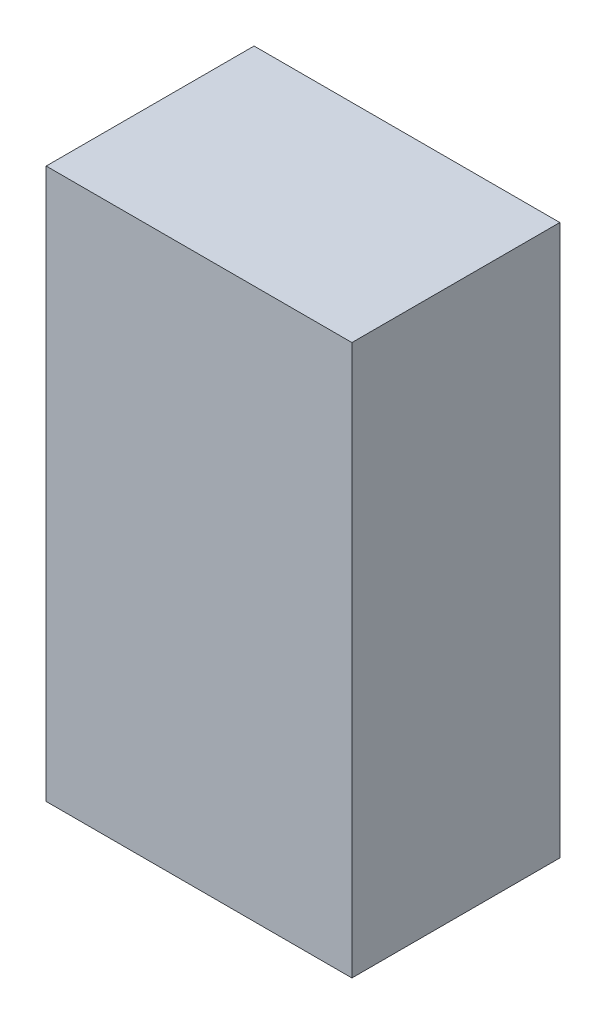
ISO-10303-21;
HEADER;
FILE_DESCRIPTION(('STEP AP214'),'2;1');
FILE_NAME('part.step','',(''),(''),'','','');
FILE_SCHEMA(('AUTOMOTIVE_DESIGN { 1 0 10303 214 1 1 1 1 }'));
ENDSEC;
DATA;
#1=APPLICATION_CONTEXT('core data for automotive mechanical design processes');
#2=APPLICATION_PROTOCOL_DEFINITION('international standard','automotive_design',2000,#1);
#3=PRODUCT_CONTEXT('',#1,'mechanical');
#4=PRODUCT('Part','Part','',(#3));
#5=PRODUCT_RELATED_PRODUCT_CATEGORY('part','',(#4));
#6=PRODUCT_DEFINITION_FORMATION('','',#4);
#7=PRODUCT_DEFINITION_CONTEXT('part definition',#1,'design');
#8=PRODUCT_DEFINITION('design','',#6,#7);
#9=PRODUCT_DEFINITION_SHAPE('','',#8);
#10=(LENGTH_UNIT() NAMED_UNIT(*) SI_UNIT(.MILLI.,.METRE.));
#11=(NAMED_UNIT(*) PLANE_ANGLE_UNIT() SI_UNIT($,.RADIAN.));
#12=(NAMED_UNIT(*) SI_UNIT($,.STERADIAN.) SOLID_ANGLE_UNIT());
#13=UNCERTAINTY_MEASURE_WITH_UNIT(LENGTH_MEASURE(1.E-05),#10,'distance_accuracy_value','');
#14=(GEOMETRIC_REPRESENTATION_CONTEXT(3) GLOBAL_UNCERTAINTY_ASSIGNED_CONTEXT((#13)) GLOBAL_UNIT_ASSIGNED_CONTEXT((#10,
#11,#12)) REPRESENTATION_CONTEXT('',''));
#15=CARTESIAN_POINT('',(0.,0.,0.));
#16=DIRECTION('',(0.,0.,1.));
#17=DIRECTION('',(1.,0.,0.));
#18=AXIS2_PLACEMENT_3D('',#15,#16,#17);
#19=CARTESIAN_POINT('',(12.5,45.,-8.5));
#20=DIRECTION('',(-1.,0.,0.));
#21=DIRECTION('',(0.,0.,1.));
#22=AXIS2_PLACEMENT_3D('',#19,#20,#21);
#23=PLANE('',#22);
#24=DIRECTION('',(0.,0.,-1.));
#25=VECTOR('',#24,1.);
#26=CARTESIAN_POINT('',(12.5,0.,-8.5));
#27=LINE('',#26,#25);
#28=CARTESIAN_POINT('',(12.5,0.,8.5));
#29=VERTEX_POINT('',#28);
#30=CARTESIAN_POINT('',(12.5,0.,-8.5));
#31=VERTEX_POINT('',#30);
#32=EDGE_CURVE('E102',#29,#31,#27,.T.);
#33=ORIENTED_EDGE('',*,*,#32,.T.);
#34=DIRECTION('',(0.,-1.,0.));
#35=VECTOR('',#34,1.);
#36=CARTESIAN_POINT('',(12.5,45.,-8.5));
#37=LINE('',#36,#35);
#38=CARTESIAN_POINT('',(12.5,45.,-8.5));
#39=VERTEX_POINT('',#38);
#40=EDGE_CURVE('E11',#39,#31,#37,.T.);
#41=ORIENTED_EDGE('',*,*,#40,.F.);
#42=DIRECTION('',(0.,0.,-1.));
#43=VECTOR('',#42,1.);
#44=CARTESIAN_POINT('',(12.5,45.,-8.5));
#45=LINE('',#44,#43);
#46=CARTESIAN_POINT('',(12.5,45.,8.5));
#47=VERTEX_POINT('',#46);
#48=EDGE_CURVE('E90',#47,#39,#45,.T.);
#49=ORIENTED_EDGE('',*,*,#48,.F.);
#50=DIRECTION('',(0.,-1.,0.));
#51=VECTOR('',#50,1.);
#52=CARTESIAN_POINT('',(12.5,45.,8.5));
#53=LINE('',#52,#51);
#54=EDGE_CURVE('E98',#47,#29,#53,.T.);
#55=ORIENTED_EDGE('',*,*,#54,.T.);
#56=EDGE_LOOP('',(#33,#41,#49,#55));
#57=FACE_BOUND('',#56,.T.);
#58=ADVANCED_FACE('F39',(#57),#23,.F.);
#59=CARTESIAN_POINT('',(-12.5,45.,-8.5));
#60=DIRECTION('',(0.,0.,1.));
#61=DIRECTION('',(1.,0.,0.));
#62=AXIS2_PLACEMENT_3D('',#59,#60,#61);
#63=PLANE('',#62);
#64=DIRECTION('',(-1.,0.,0.));
#65=VECTOR('',#64,1.);
#66=CARTESIAN_POINT('',(-12.5,0.,-8.5));
#67=LINE('',#66,#65);
#68=CARTESIAN_POINT('',(-12.5,0.,-8.5));
#69=VERTEX_POINT('',#68);
#70=EDGE_CURVE('E94',#31,#69,#67,.T.);
#71=ORIENTED_EDGE('',*,*,#70,.T.);
#72=DIRECTION('',(0.,-1.,0.));
#73=VECTOR('',#72,1.);
#74=CARTESIAN_POINT('',(-12.5,45.,-8.5));
#75=LINE('',#74,#73);
#76=CARTESIAN_POINT('',(-12.5,45.,-8.5));
#77=VERTEX_POINT('',#76);
#78=EDGE_CURVE('E47',#77,#69,#75,.T.);
#79=ORIENTED_EDGE('',*,*,#78,.F.);
#80=DIRECTION('',(-1.,0.,0.));
#81=VECTOR('',#80,1.);
#82=CARTESIAN_POINT('',(-12.5,45.,-8.5));
#83=LINE('',#82,#81);
#84=EDGE_CURVE('E85',#39,#77,#83,.T.);
#85=ORIENTED_EDGE('',*,*,#84,.F.);
#86=ORIENTED_EDGE('',*,*,#40,.T.);
#87=EDGE_LOOP('',(#71,#79,#85,#86));
#88=FACE_BOUND('',#87,.T.);
#89=ADVANCED_FACE('F93',(#88),#63,.F.);
#90=CARTESIAN_POINT('',(-12.5,45.,-8.5));
#91=DIRECTION('',(1.,0.,0.));
#92=DIRECTION('',(0.,0.,-1.));
#93=AXIS2_PLACEMENT_3D('',#90,#91,#92);
#94=PLANE('',#93);
#95=DIRECTION('',(0.,0.,1.));
#96=VECTOR('',#95,1.);
#97=CARTESIAN_POINT('',(-12.5,0.,-8.5));
#98=LINE('',#97,#96);
#99=CARTESIAN_POINT('',(-12.5,0.,8.5));
#100=VERTEX_POINT('',#99);
#101=EDGE_CURVE('E72',#69,#100,#98,.T.);
#102=ORIENTED_EDGE('',*,*,#101,.T.);
#103=DIRECTION('',(0.,-1.,0.));
#104=VECTOR('',#103,1.);
#105=CARTESIAN_POINT('',(-12.5,45.,8.5));
#106=LINE('',#105,#104);
#107=CARTESIAN_POINT('',(-12.5,45.,8.5));
#108=VERTEX_POINT('',#107);
#109=EDGE_CURVE('E95',#108,#100,#106,.T.);
#110=ORIENTED_EDGE('',*,*,#109,.F.);
#111=DIRECTION('',(0.,0.,1.));
#112=VECTOR('',#111,1.);
#113=CARTESIAN_POINT('',(-12.5,45.,-8.5));
#114=LINE('',#113,#112);
#115=EDGE_CURVE('E88',#77,#108,#114,.T.);
#116=ORIENTED_EDGE('',*,*,#115,.F.);
#117=ORIENTED_EDGE('',*,*,#78,.T.);
#118=EDGE_LOOP('',(#102,#110,#116,#117));
#119=FACE_BOUND('',#118,.T.);
#120=ADVANCED_FACE('F96',(#119),#94,.F.);
#121=CARTESIAN_POINT('',(-12.5,45.,8.5));
#122=DIRECTION('',(0.,0.,-1.));
#123=DIRECTION('',(-1.,0.,0.));
#124=AXIS2_PLACEMENT_3D('',#121,#122,#123);
#125=PLANE('',#124);
#126=DIRECTION('',(1.,0.,0.));
#127=VECTOR('',#126,1.);
#128=CARTESIAN_POINT('',(-12.5,0.,8.5));
#129=LINE('',#128,#127);
#130=EDGE_CURVE('E78',#100,#29,#129,.T.);
#131=ORIENTED_EDGE('',*,*,#130,.T.);
#132=ORIENTED_EDGE('',*,*,#54,.F.);
#133=DIRECTION('',(1.,0.,0.));
#134=VECTOR('',#133,1.);
#135=CARTESIAN_POINT('',(-12.5,45.,8.5));
#136=LINE('',#135,#134);
#137=EDGE_CURVE('E55',#108,#47,#136,.T.);
#138=ORIENTED_EDGE('',*,*,#137,.F.);
#139=ORIENTED_EDGE('',*,*,#109,.T.);
#140=EDGE_LOOP('',(#131,#132,#138,#139));
#141=FACE_BOUND('',#140,.T.);
#142=ADVANCED_FACE('F109',(#141),#125,.F.);
#143=CARTESIAN_POINT('',(0.,45.,0.));
#144=DIRECTION('',(0.,1.,0.));
#145=DIRECTION('',(0.,0.,1.));
#146=AXIS2_PLACEMENT_3D('',#143,#144,#145);
#147=PLANE('',#146);
#148=ORIENTED_EDGE('',*,*,#48,.T.);
#149=ORIENTED_EDGE('',*,*,#84,.T.);
#150=ORIENTED_EDGE('',*,*,#115,.T.);
#151=ORIENTED_EDGE('',*,*,#137,.T.);
#152=EDGE_LOOP('',(#148,#149,#150,#151));
#153=FACE_BOUND('',#152,.T.);
#154=ADVANCED_FACE('F86',(#153),#147,.T.);
#155=CARTESIAN_POINT('',(0.,0.,0.));
#156=DIRECTION('',(0.,1.,0.));
#157=DIRECTION('',(0.,0.,1.));
#158=AXIS2_PLACEMENT_3D('',#155,#156,#157);
#159=PLANE('',#158);
#160=ORIENTED_EDGE('',*,*,#32,.F.);
#161=ORIENTED_EDGE('',*,*,#130,.F.);
#162=ORIENTED_EDGE('',*,*,#101,.F.);
#163=ORIENTED_EDGE('',*,*,#70,.F.);
#164=EDGE_LOOP('',(#160,#161,#162,#163));
#165=FACE_BOUND('',#164,.T.);
#166=ADVANCED_FACE('F112',(#165),#159,.F.);
#167=CLOSED_SHELL('',(#58,#89,#120,#142,#154,#166));
#168=MANIFOLD_SOLID_BREP('B2',#167);
#169=ADVANCED_BREP_SHAPE_REPRESENTATION('',(#18,#168),#14);
#170=SHAPE_DEFINITION_REPRESENTATION(#9,#169);
ENDSEC;
END-ISO-10303-21;
